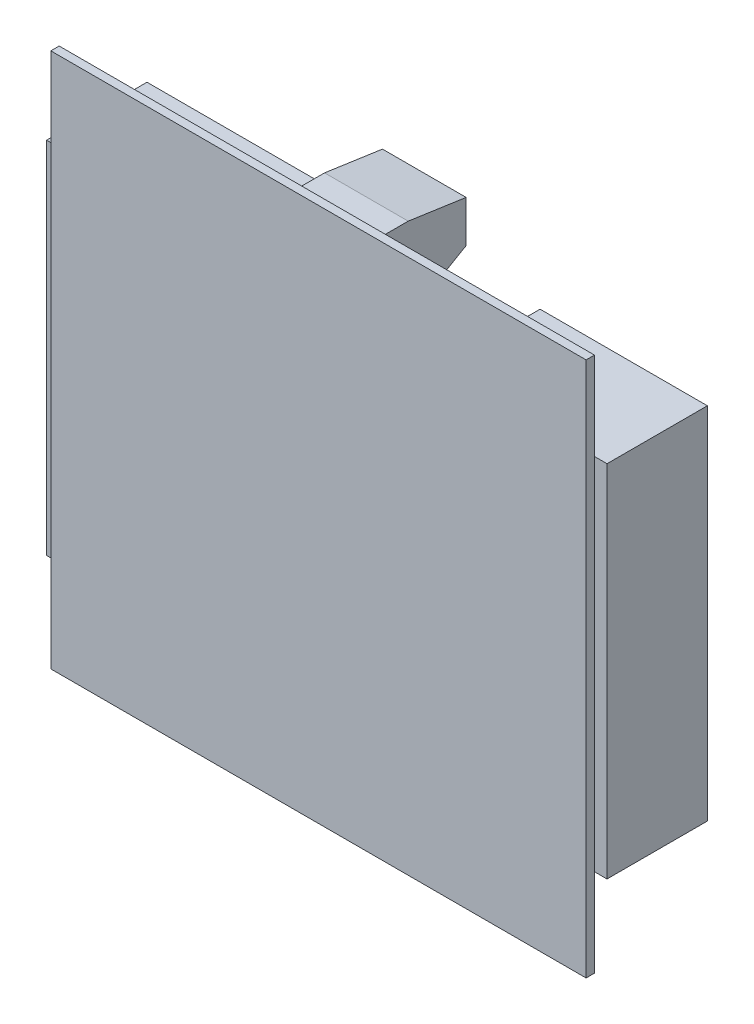
ISO-10303-21;
HEADER;
FILE_DESCRIPTION(('STEP AP214'),'2;1');
FILE_NAME('part.step','',(''),(''),'','','');
FILE_SCHEMA(('AUTOMOTIVE_DESIGN { 1 0 10303 214 1 1 1 1 }'));
ENDSEC;
DATA;
#1=APPLICATION_CONTEXT('core data for automotive mechanical design processes');
#2=APPLICATION_PROTOCOL_DEFINITION('international standard','automotive_design',2000,#1);
#3=PRODUCT_CONTEXT('',#1,'mechanical');
#4=PRODUCT('Part','Part','',(#3));
#5=PRODUCT_RELATED_PRODUCT_CATEGORY('part','',(#4));
#6=PRODUCT_DEFINITION_FORMATION('','',#4);
#7=PRODUCT_DEFINITION_CONTEXT('part definition',#1,'design');
#8=PRODUCT_DEFINITION('design','',#6,#7);
#9=PRODUCT_DEFINITION_SHAPE('','',#8);
#10=(LENGTH_UNIT() NAMED_UNIT(*) SI_UNIT(.MILLI.,.METRE.));
#11=(NAMED_UNIT(*) PLANE_ANGLE_UNIT() SI_UNIT($,.RADIAN.));
#12=(NAMED_UNIT(*) SI_UNIT($,.STERADIAN.) SOLID_ANGLE_UNIT());
#13=UNCERTAINTY_MEASURE_WITH_UNIT(LENGTH_MEASURE(1.E-05),#10,'distance_accuracy_value','');
#14=(GEOMETRIC_REPRESENTATION_CONTEXT(3) GLOBAL_UNCERTAINTY_ASSIGNED_CONTEXT((#13)) GLOBAL_UNIT_ASSIGNED_CONTEXT((#10,
#11,#12)) REPRESENTATION_CONTEXT('',''));
#15=CARTESIAN_POINT('',(0.,0.,0.));
#16=DIRECTION('',(0.,0.,1.));
#17=DIRECTION('',(1.,0.,0.));
#18=AXIS2_PLACEMENT_3D('',#15,#16,#17);
#19=CARTESIAN_POINT('',(0.,0.,0.));
#20=DIRECTION('',(0.,0.,-1.));
#21=DIRECTION('',(-1.,0.,0.));
#22=AXIS2_PLACEMENT_3D('',#19,#20,#21);
#23=PLANE('',#22);
#24=DIRECTION('',(0.,-1.,0.));
#25=VECTOR('',#24,1.);
#26=CARTESIAN_POINT('',(37.,62.,0.));
#27=LINE('',#26,#25);
#28=CARTESIAN_POINT('',(37.,62.,0.));
#29=VERTEX_POINT('',#28);
#30=CARTESIAN_POINT('',(37.,52.,0.));
#31=VERTEX_POINT('',#30);
#32=EDGE_CURVE('E218',#29,#31,#27,.T.);
#33=ORIENTED_EDGE('',*,*,#32,.F.);
#34=DIRECTION('',(-1.,0.,0.));
#35=VECTOR('',#34,1.);
#36=CARTESIAN_POINT('',(37.,62.,0.));
#37=LINE('',#36,#35);
#38=CARTESIAN_POINT('',(27.,62.,0.));
#39=VERTEX_POINT('',#38);
#40=EDGE_CURVE('E230',#29,#39,#37,.T.);
#41=ORIENTED_EDGE('',*,*,#40,.T.);
#42=DIRECTION('',(0.,-1.,0.));
#43=VECTOR('',#42,1.);
#44=CARTESIAN_POINT('',(27.,62.,0.));
#45=LINE('',#44,#43);
#46=CARTESIAN_POINT('',(27.,52.,0.));
#47=VERTEX_POINT('',#46);
#48=EDGE_CURVE('E259',#39,#47,#45,.T.);
#49=ORIENTED_EDGE('',*,*,#48,.T.);
#50=DIRECTION('',(-1.,0.,0.));
#51=VECTOR('',#50,1.);
#52=CARTESIAN_POINT('',(37.,52.,0.));
#53=LINE('',#52,#51);
#54=EDGE_CURVE('E238',#31,#47,#53,.T.);
#55=ORIENTED_EDGE('',*,*,#54,.F.);
#56=EDGE_LOOP('',(#33,#41,#49,#55));
#57=FACE_BOUND('',#56,.T.);
#58=DIRECTION('',(1.,0.,0.));
#59=VECTOR('',#58,1.);
#60=CARTESIAN_POINT('',(65.5,10.5,0.));
#61=LINE('',#60,#59);
#62=CARTESIAN_POINT('',(45.5,10.5,0.));
#63=VERTEX_POINT('',#62);
#64=CARTESIAN_POINT('',(64.,10.5,0.));
#65=VERTEX_POINT('',#64);
#66=EDGE_CURVE('E353',#63,#65,#61,.T.);
#67=ORIENTED_EDGE('',*,*,#66,.T.);
#68=DIRECTION('',(0.,1.,0.));
#69=VECTOR('',#68,1.);
#70=CARTESIAN_POINT('',(64.,0.,0.));
#71=LINE('',#70,#69);
#72=CARTESIAN_POINT('',(64.,0.,0.));
#73=VERTEX_POINT('',#72);
#74=EDGE_CURVE('E462',#73,#65,#71,.T.);
#75=ORIENTED_EDGE('',*,*,#74,.F.);
#76=DIRECTION('',(1.,0.,0.));
#77=VECTOR('',#76,1.);
#78=CARTESIAN_POINT('',(0.,0.,0.));
#79=LINE('',#78,#77);
#80=CARTESIAN_POINT('',(0.,0.,0.));
#81=VERTEX_POINT('',#80);
#82=EDGE_CURVE('E457',#81,#73,#79,.T.);
#83=ORIENTED_EDGE('',*,*,#82,.F.);
#84=DIRECTION('',(0.,-1.,0.));
#85=VECTOR('',#84,1.);
#86=CARTESIAN_POINT('',(0.,0.,0.));
#87=LINE('',#86,#85);
#88=CARTESIAN_POINT('',(0.,10.5,0.));
#89=VERTEX_POINT('',#88);
#90=EDGE_CURVE('E429',#89,#81,#87,.T.);
#91=ORIENTED_EDGE('',*,*,#90,.F.);
#92=DIRECTION('',(1.,0.,0.));
#93=VECTOR('',#92,1.);
#94=CARTESIAN_POINT('',(-1.49999999999999,10.5,0.));
#95=LINE('',#94,#93);
#96=CARTESIAN_POINT('',(18.5,10.5,0.));
#97=VERTEX_POINT('',#96);
#98=EDGE_CURVE('E11',#89,#97,#95,.T.);
#99=ORIENTED_EDGE('',*,*,#98,.T.);
#100=DIRECTION('',(0.,1.,0.));
#101=VECTOR('',#100,1.);
#102=CARTESIAN_POINT('',(18.5,53.5,0.));
#103=LINE('',#102,#101);
#104=CARTESIAN_POINT('',(18.5,53.5,0.));
#105=VERTEX_POINT('',#104);
#106=EDGE_CURVE('E417',#97,#105,#103,.T.);
#107=ORIENTED_EDGE('',*,*,#106,.T.);
#108=DIRECTION('',(-1.,0.,0.));
#109=VECTOR('',#108,1.);
#110=CARTESIAN_POINT('',(-1.5,53.5,0.));
#111=LINE('',#110,#109);
#112=CARTESIAN_POINT('',(0.,53.5,0.));
#113=VERTEX_POINT('',#112);
#114=EDGE_CURVE('E399',#105,#113,#111,.T.);
#115=ORIENTED_EDGE('',*,*,#114,.T.);
#116=CARTESIAN_POINT('',(0.,64.,0.));
#117=VERTEX_POINT('',#116);
#118=EDGE_CURVE('E453',#117,#113,#87,.T.);
#119=ORIENTED_EDGE('',*,*,#118,.F.);
#120=DIRECTION('',(-1.,0.,0.));
#121=VECTOR('',#120,1.);
#122=CARTESIAN_POINT('',(0.,64.,0.));
#123=LINE('',#122,#121);
#124=CARTESIAN_POINT('',(64.,64.,0.));
#125=VERTEX_POINT('',#124);
#126=EDGE_CURVE('E443',#125,#117,#123,.T.);
#127=ORIENTED_EDGE('',*,*,#126,.F.);
#128=CARTESIAN_POINT('',(64.,53.5,0.));
#129=VERTEX_POINT('',#128);
#130=EDGE_CURVE('E461',#129,#125,#71,.T.);
#131=ORIENTED_EDGE('',*,*,#130,.F.);
#132=DIRECTION('',(-1.,0.,0.));
#133=VECTOR('',#132,1.);
#134=CARTESIAN_POINT('',(65.5,53.5,0.));
#135=LINE('',#134,#133);
#136=CARTESIAN_POINT('',(45.5,53.5,0.));
#137=VERTEX_POINT('',#136);
#138=EDGE_CURVE('E369',#129,#137,#135,.T.);
#139=ORIENTED_EDGE('',*,*,#138,.T.);
#140=DIRECTION('',(0.,-1.,0.));
#141=VECTOR('',#140,1.);
#142=CARTESIAN_POINT('',(45.5,53.5,0.));
#143=LINE('',#142,#141);
#144=EDGE_CURVE('E373',#137,#63,#143,.T.);
#145=ORIENTED_EDGE('',*,*,#144,.T.);
#146=EDGE_LOOP('',(#67,#75,#83,#91,#99,#107,#115,#119,#127,#131,#139,#145));
#147=FACE_BOUND('',#146,.T.);
#148=DIRECTION('',(-1.,0.,0.));
#149=VECTOR('',#148,1.);
#150=CARTESIAN_POINT('',(37.,2.,0.));
#151=LINE('',#150,#149);
#152=CARTESIAN_POINT('',(37.,2.,0.));
#153=VERTEX_POINT('',#152);
#154=CARTESIAN_POINT('',(27.,2.,0.));
#155=VERTEX_POINT('',#154);
#156=EDGE_CURVE('E65',#153,#155,#151,.T.);
#157=ORIENTED_EDGE('',*,*,#156,.F.);
#158=DIRECTION('',(0.,-1.,0.));
#159=VECTOR('',#158,1.);
#160=CARTESIAN_POINT('',(37.,2.,0.));
#161=LINE('',#160,#159);
#162=CARTESIAN_POINT('',(37.,12.,0.));
#163=VERTEX_POINT('',#162);
#164=EDGE_CURVE('E288',#163,#153,#161,.T.);
#165=ORIENTED_EDGE('',*,*,#164,.F.);
#166=DIRECTION('',(-1.,0.,0.));
#167=VECTOR('',#166,1.);
#168=CARTESIAN_POINT('',(37.,12.,0.));
#169=LINE('',#168,#167);
#170=CARTESIAN_POINT('',(27.,12.,0.));
#171=VERTEX_POINT('',#170);
#172=EDGE_CURVE('E309',#163,#171,#169,.T.);
#173=ORIENTED_EDGE('',*,*,#172,.T.);
#174=DIRECTION('',(0.,-1.,0.));
#175=VECTOR('',#174,1.);
#176=CARTESIAN_POINT('',(27.,2.,0.));
#177=LINE('',#176,#175);
#178=EDGE_CURVE('E237',#171,#155,#177,.T.);
#179=ORIENTED_EDGE('',*,*,#178,.T.);
#180=EDGE_LOOP('',(#157,#165,#173,#179));
#181=FACE_BOUND('',#180,.T.);
#182=ADVANCED_FACE('F39',(#57,#147,#181),#23,.T.);
#183=CARTESIAN_POINT('',(0.,0.,1.));
#184=DIRECTION('',(1.,0.,0.));
#185=DIRECTION('',(0.,0.,-1.));
#186=AXIS2_PLACEMENT_3D('',#183,#184,#185);
#187=PLANE('',#186);
#188=ORIENTED_EDGE('',*,*,#118,.T.);
#189=EDGE_CURVE('E458',#113,#89,#87,.T.);
#190=ORIENTED_EDGE('',*,*,#189,.T.);
#191=ORIENTED_EDGE('',*,*,#90,.T.);
#192=DIRECTION('',(0.,0.,-1.));
#193=VECTOR('',#192,1.);
#194=CARTESIAN_POINT('',(0.,0.,1.));
#195=LINE('',#194,#193);
#196=CARTESIAN_POINT('',(0.,0.,1.));
#197=VERTEX_POINT('',#196);
#198=EDGE_CURVE('E43',#197,#81,#195,.T.);
#199=ORIENTED_EDGE('',*,*,#198,.F.);
#200=DIRECTION('',(0.,-1.,0.));
#201=VECTOR('',#200,1.);
#202=CARTESIAN_POINT('',(0.,0.,1.));
#203=LINE('',#202,#201);
#204=CARTESIAN_POINT('',(0.,64.,1.));
#205=VERTEX_POINT('',#204);
#206=EDGE_CURVE('E438',#205,#197,#203,.T.);
#207=ORIENTED_EDGE('',*,*,#206,.F.);
#208=DIRECTION('',(0.,0.,-1.));
#209=VECTOR('',#208,1.);
#210=CARTESIAN_POINT('',(0.,64.,1.));
#211=LINE('',#210,#209);
#212=EDGE_CURVE('E452',#205,#117,#211,.T.);
#213=ORIENTED_EDGE('',*,*,#212,.T.);
#214=EDGE_LOOP('',(#188,#190,#191,#199,#207,#213));
#215=FACE_BOUND('',#214,.T.);
#216=ADVANCED_FACE('F41',(#215),#187,.F.);
#217=CARTESIAN_POINT('',(0.,0.,1.));
#218=DIRECTION('',(0.,1.,0.));
#219=DIRECTION('',(0.,0.,1.));
#220=AXIS2_PLACEMENT_3D('',#217,#218,#219);
#221=PLANE('',#220);
#222=ORIENTED_EDGE('',*,*,#82,.T.);
#223=DIRECTION('',(0.,0.,-1.));
#224=VECTOR('',#223,1.);
#225=CARTESIAN_POINT('',(64.,0.,1.));
#226=LINE('',#225,#224);
#227=CARTESIAN_POINT('',(64.,0.,1.));
#228=VERTEX_POINT('',#227);
#229=EDGE_CURVE('E475',#228,#73,#226,.T.);
#230=ORIENTED_EDGE('',*,*,#229,.F.);
#231=DIRECTION('',(1.,0.,0.));
#232=VECTOR('',#231,1.);
#233=CARTESIAN_POINT('',(0.,0.,1.));
#234=LINE('',#233,#232);
#235=EDGE_CURVE('E442',#197,#228,#234,.T.);
#236=ORIENTED_EDGE('',*,*,#235,.F.);
#237=ORIENTED_EDGE('',*,*,#198,.T.);
#238=EDGE_LOOP('',(#222,#230,#236,#237));
#239=FACE_BOUND('',#238,.T.);
#240=ADVANCED_FACE('F486',(#239),#221,.F.);
#241=CARTESIAN_POINT('',(64.,0.,1.));
#242=DIRECTION('',(-1.,0.,0.));
#243=DIRECTION('',(0.,0.,1.));
#244=AXIS2_PLACEMENT_3D('',#241,#242,#243);
#245=PLANE('',#244);
#246=ORIENTED_EDGE('',*,*,#74,.T.);
#247=EDGE_CURVE('E466',#65,#129,#71,.T.);
#248=ORIENTED_EDGE('',*,*,#247,.T.);
#249=ORIENTED_EDGE('',*,*,#130,.T.);
#250=DIRECTION('',(0.,0.,-1.));
#251=VECTOR('',#250,1.);
#252=CARTESIAN_POINT('',(64.,64.,1.));
#253=LINE('',#252,#251);
#254=CARTESIAN_POINT('',(64.,64.,1.));
#255=VERTEX_POINT('',#254);
#256=EDGE_CURVE('E472',#255,#125,#253,.T.);
#257=ORIENTED_EDGE('',*,*,#256,.F.);
#258=DIRECTION('',(0.,1.,0.));
#259=VECTOR('',#258,1.);
#260=CARTESIAN_POINT('',(64.,0.,1.));
#261=LINE('',#260,#259);
#262=EDGE_CURVE('E446',#228,#255,#261,.T.);
#263=ORIENTED_EDGE('',*,*,#262,.F.);
#264=ORIENTED_EDGE('',*,*,#229,.T.);
#265=EDGE_LOOP('',(#246,#248,#249,#257,#263,#264));
#266=FACE_BOUND('',#265,.T.);
#267=ADVANCED_FACE('F496',(#266),#245,.F.);
#268=CARTESIAN_POINT('',(0.,64.,1.));
#269=DIRECTION('',(0.,-1.,0.));
#270=DIRECTION('',(0.,0.,-1.));
#271=AXIS2_PLACEMENT_3D('',#268,#269,#270);
#272=PLANE('',#271);
#273=ORIENTED_EDGE('',*,*,#126,.T.);
#274=ORIENTED_EDGE('',*,*,#212,.F.);
#275=DIRECTION('',(-1.,0.,0.));
#276=VECTOR('',#275,1.);
#277=CARTESIAN_POINT('',(0.,64.,1.));
#278=LINE('',#277,#276);
#279=EDGE_CURVE('E449',#255,#205,#278,.T.);
#280=ORIENTED_EDGE('',*,*,#279,.F.);
#281=ORIENTED_EDGE('',*,*,#256,.T.);
#282=EDGE_LOOP('',(#273,#274,#280,#281));
#283=FACE_BOUND('',#282,.T.);
#284=ADVANCED_FACE('F549',(#283),#272,.F.);
#285=CARTESIAN_POINT('',(0.,0.,1.));
#286=DIRECTION('',(0.,0.,-1.));
#287=DIRECTION('',(-1.,0.,0.));
#288=AXIS2_PLACEMENT_3D('',#285,#286,#287);
#289=PLANE('',#288);
#290=ORIENTED_EDGE('',*,*,#206,.T.);
#291=ORIENTED_EDGE('',*,*,#235,.T.);
#292=ORIENTED_EDGE('',*,*,#262,.T.);
#293=ORIENTED_EDGE('',*,*,#279,.T.);
#294=EDGE_LOOP('',(#290,#291,#292,#293));
#295=FACE_BOUND('',#294,.T.);
#296=ADVANCED_FACE('F547',(#295),#289,.F.);
#297=CARTESIAN_POINT('',(0.,0.,0.));
#298=DIRECTION('',(0.,0.,1.));
#299=DIRECTION('',(1.,0.,0.));
#300=AXIS2_PLACEMENT_3D('',#297,#298,#299);
#301=PLANE('',#300);
#302=ORIENTED_EDGE('',*,*,#189,.F.);
#303=CARTESIAN_POINT('',(-1.5,53.5,0.));
#304=VERTEX_POINT('',#303);
#305=EDGE_CURVE('E421',#113,#304,#111,.T.);
#306=ORIENTED_EDGE('',*,*,#305,.T.);
#307=DIRECTION('',(0.,-1.,0.));
#308=VECTOR('',#307,1.);
#309=CARTESIAN_POINT('',(-1.5,53.5,0.));
#310=LINE('',#309,#308);
#311=CARTESIAN_POINT('',(-1.49999999999999,10.5,0.));
#312=VERTEX_POINT('',#311);
#313=EDGE_CURVE('E385',#304,#312,#310,.T.);
#314=ORIENTED_EDGE('',*,*,#313,.T.);
#315=EDGE_CURVE('E50',#312,#89,#95,.T.);
#316=ORIENTED_EDGE('',*,*,#315,.T.);
#317=EDGE_LOOP('',(#302,#306,#314,#316));
#318=FACE_BOUND('',#317,.T.);
#319=ADVANCED_FACE('F574',(#318),#301,.T.);
#320=CARTESIAN_POINT('',(-1.5,53.5,-12.));
#321=DIRECTION('',(-1.,0.,0.));
#322=DIRECTION('',(0.,-1.,0.));
#323=AXIS2_PLACEMENT_3D('',#320,#321,#322);
#324=PLANE('',#323);
#325=ORIENTED_EDGE('',*,*,#313,.F.);
#326=DIRECTION('',(0.,0.,1.));
#327=VECTOR('',#326,1.);
#328=CARTESIAN_POINT('',(-1.5,53.5,-12.));
#329=LINE('',#328,#327);
#330=CARTESIAN_POINT('',(-1.5,53.5,-12.));
#331=VERTEX_POINT('',#330);
#332=EDGE_CURVE('E425',#331,#304,#329,.T.);
#333=ORIENTED_EDGE('',*,*,#332,.F.);
#334=DIRECTION('',(0.,-1.,0.));
#335=VECTOR('',#334,1.);
#336=CARTESIAN_POINT('',(-1.5,53.5,-12.));
#337=LINE('',#336,#335);
#338=CARTESIAN_POINT('',(-1.49999999999999,10.5,-12.));
#339=VERTEX_POINT('',#338);
#340=EDGE_CURVE('E394',#331,#339,#337,.T.);
#341=ORIENTED_EDGE('',*,*,#340,.T.);
#342=DIRECTION('',(0.,0.,1.));
#343=VECTOR('',#342,1.);
#344=CARTESIAN_POINT('',(-1.49999999999999,10.5,-12.));
#345=LINE('',#344,#343);
#346=EDGE_CURVE('E411',#339,#312,#345,.T.);
#347=ORIENTED_EDGE('',*,*,#346,.T.);
#348=EDGE_LOOP('',(#325,#333,#341,#347));
#349=FACE_BOUND('',#348,.T.);
#350=ADVANCED_FACE('F580',(#349),#324,.T.);
#351=CARTESIAN_POINT('',(-1.5,53.5,-12.));
#352=DIRECTION('',(0.,1.,0.));
#353=DIRECTION('',(0.,0.,1.));
#354=AXIS2_PLACEMENT_3D('',#351,#352,#353);
#355=PLANE('',#354);
#356=ORIENTED_EDGE('',*,*,#114,.F.);
#357=DIRECTION('',(0.,0.,1.));
#358=VECTOR('',#357,1.);
#359=CARTESIAN_POINT('',(18.5,53.5,-12.));
#360=LINE('',#359,#358);
#361=CARTESIAN_POINT('',(18.5,53.5,-12.));
#362=VERTEX_POINT('',#361);
#363=EDGE_CURVE('E430',#362,#105,#360,.T.);
#364=ORIENTED_EDGE('',*,*,#363,.F.);
#365=DIRECTION('',(-1.,0.,0.));
#366=VECTOR('',#365,1.);
#367=CARTESIAN_POINT('',(-1.5,53.5,-12.));
#368=LINE('',#367,#366);
#369=EDGE_CURVE('E407',#362,#331,#368,.T.);
#370=ORIENTED_EDGE('',*,*,#369,.T.);
#371=ORIENTED_EDGE('',*,*,#332,.T.);
#372=ORIENTED_EDGE('',*,*,#305,.F.);
#373=EDGE_LOOP('',(#356,#364,#370,#371,#372));
#374=FACE_BOUND('',#373,.T.);
#375=ADVANCED_FACE('F588',(#374),#355,.T.);
#376=CARTESIAN_POINT('',(18.5,53.5,-12.));
#377=DIRECTION('',(1.,0.,0.));
#378=DIRECTION('',(0.,1.,0.));
#379=AXIS2_PLACEMENT_3D('',#376,#377,#378);
#380=PLANE('',#379);
#381=ORIENTED_EDGE('',*,*,#106,.F.);
#382=DIRECTION('',(0.,0.,1.));
#383=VECTOR('',#382,1.);
#384=CARTESIAN_POINT('',(18.5,10.5,-12.));
#385=LINE('',#384,#383);
#386=CARTESIAN_POINT('',(18.5,10.5,-12.));
#387=VERTEX_POINT('',#386);
#388=EDGE_CURVE('E433',#387,#97,#385,.T.);
#389=ORIENTED_EDGE('',*,*,#388,.F.);
#390=DIRECTION('',(0.,1.,0.));
#391=VECTOR('',#390,1.);
#392=CARTESIAN_POINT('',(18.5,53.5,-12.));
#393=LINE('',#392,#391);
#394=EDGE_CURVE('E403',#387,#362,#393,.T.);
#395=ORIENTED_EDGE('',*,*,#394,.T.);
#396=ORIENTED_EDGE('',*,*,#363,.T.);
#397=EDGE_LOOP('',(#381,#389,#395,#396));
#398=FACE_BOUND('',#397,.T.);
#399=ADVANCED_FACE('F595',(#398),#380,.T.);
#400=CARTESIAN_POINT('',(-1.49999999999999,10.5,-12.));
#401=DIRECTION('',(0.,-1.,0.));
#402=DIRECTION('',(1.,0.,0.));
#403=AXIS2_PLACEMENT_3D('',#400,#401,#402);
#404=PLANE('',#403);
#405=ORIENTED_EDGE('',*,*,#315,.F.);
#406=ORIENTED_EDGE('',*,*,#346,.F.);
#407=DIRECTION('',(1.,0.,0.));
#408=VECTOR('',#407,1.);
#409=CARTESIAN_POINT('',(-1.49999999999999,10.5,-12.));
#410=LINE('',#409,#408);
#411=EDGE_CURVE('E398',#339,#387,#410,.T.);
#412=ORIENTED_EDGE('',*,*,#411,.T.);
#413=ORIENTED_EDGE('',*,*,#388,.T.);
#414=ORIENTED_EDGE('',*,*,#98,.F.);
#415=EDGE_LOOP('',(#405,#406,#412,#413,#414));
#416=FACE_BOUND('',#415,.T.);
#417=ADVANCED_FACE('F603',(#416),#404,.T.);
#418=CARTESIAN_POINT('',(0.,0.,-12.));
#419=DIRECTION('',(0.,0.,1.));
#420=DIRECTION('',(1.,0.,0.));
#421=AXIS2_PLACEMENT_3D('',#418,#419,#420);
#422=PLANE('',#421);
#423=ORIENTED_EDGE('',*,*,#340,.F.);
#424=ORIENTED_EDGE('',*,*,#369,.F.);
#425=ORIENTED_EDGE('',*,*,#394,.F.);
#426=ORIENTED_EDGE('',*,*,#411,.F.);
#427=EDGE_LOOP('',(#423,#424,#425,#426));
#428=FACE_BOUND('',#427,.T.);
#429=ADVANCED_FACE('F611',(#428),#422,.F.);
#430=CARTESIAN_POINT('',(0.,0.,0.));
#431=DIRECTION('',(0.,0.,-1.));
#432=DIRECTION('',(-1.,0.,0.));
#433=AXIS2_PLACEMENT_3D('',#430,#431,#432);
#434=PLANE('',#433);
#435=CARTESIAN_POINT('',(65.5,53.5,0.));
#436=VERTEX_POINT('',#435);
#437=EDGE_CURVE('E370',#436,#129,#135,.T.);
#438=ORIENTED_EDGE('',*,*,#437,.T.);
#439=ORIENTED_EDGE('',*,*,#247,.F.);
#440=CARTESIAN_POINT('',(65.5,10.5,0.));
#441=VERTEX_POINT('',#440);
#442=EDGE_CURVE('E377',#65,#441,#61,.T.);
#443=ORIENTED_EDGE('',*,*,#442,.T.);
#444=DIRECTION('',(0.,1.,0.));
#445=VECTOR('',#444,1.);
#446=CARTESIAN_POINT('',(65.5,53.5,0.));
#447=LINE('',#446,#445);
#448=EDGE_CURVE('E347',#441,#436,#447,.T.);
#449=ORIENTED_EDGE('',*,*,#448,.T.);
#450=EDGE_LOOP('',(#438,#439,#443,#449));
#451=FACE_BOUND('',#450,.T.);
#452=ADVANCED_FACE('F522',(#451),#434,.F.);
#453=CARTESIAN_POINT('',(65.5,53.5,-12.));
#454=DIRECTION('',(1.,0.,0.));
#455=DIRECTION('',(0.,1.,0.));
#456=AXIS2_PLACEMENT_3D('',#453,#454,#455);
#457=PLANE('',#456);
#458=ORIENTED_EDGE('',*,*,#448,.F.);
#459=DIRECTION('',(0.,0.,1.));
#460=VECTOR('',#459,1.);
#461=CARTESIAN_POINT('',(65.5,10.5,-12.));
#462=LINE('',#461,#460);
#463=CARTESIAN_POINT('',(65.5,10.5,-12.));
#464=VERTEX_POINT('',#463);
#465=EDGE_CURVE('E381',#464,#441,#462,.T.);
#466=ORIENTED_EDGE('',*,*,#465,.F.);
#467=DIRECTION('',(0.,1.,0.));
#468=VECTOR('',#467,1.);
#469=CARTESIAN_POINT('',(65.5,53.5,-12.));
#470=LINE('',#469,#468);
#471=CARTESIAN_POINT('',(65.5,53.5,-12.));
#472=VERTEX_POINT('',#471);
#473=EDGE_CURVE('E348',#464,#472,#470,.T.);
#474=ORIENTED_EDGE('',*,*,#473,.T.);
#475=DIRECTION('',(0.,0.,1.));
#476=VECTOR('',#475,1.);
#477=CARTESIAN_POINT('',(65.5,53.5,-12.));
#478=LINE('',#477,#476);
#479=EDGE_CURVE('E365',#472,#436,#478,.T.);
#480=ORIENTED_EDGE('',*,*,#479,.T.);
#481=EDGE_LOOP('',(#458,#466,#474,#480));
#482=FACE_BOUND('',#481,.T.);
#483=ADVANCED_FACE('F524',(#482),#457,.T.);
#484=CARTESIAN_POINT('',(65.5,10.5,-12.));
#485=DIRECTION('',(0.,-1.,0.));
#486=DIRECTION('',(1.,0.,0.));
#487=AXIS2_PLACEMENT_3D('',#484,#485,#486);
#488=PLANE('',#487);
#489=ORIENTED_EDGE('',*,*,#66,.F.);
#490=DIRECTION('',(0.,0.,1.));
#491=VECTOR('',#490,1.);
#492=CARTESIAN_POINT('',(45.5,10.5,-12.));
#493=LINE('',#492,#491);
#494=CARTESIAN_POINT('',(45.5,10.5,-12.));
#495=VERTEX_POINT('',#494);
#496=EDGE_CURVE('E386',#495,#63,#493,.T.);
#497=ORIENTED_EDGE('',*,*,#496,.F.);
#498=DIRECTION('',(1.,0.,0.));
#499=VECTOR('',#498,1.);
#500=CARTESIAN_POINT('',(65.5,10.5,-12.));
#501=LINE('',#500,#499);
#502=EDGE_CURVE('E361',#495,#464,#501,.T.);
#503=ORIENTED_EDGE('',*,*,#502,.T.);
#504=ORIENTED_EDGE('',*,*,#465,.T.);
#505=ORIENTED_EDGE('',*,*,#442,.F.);
#506=EDGE_LOOP('',(#489,#497,#503,#504,#505));
#507=FACE_BOUND('',#506,.T.);
#508=ADVANCED_FACE('F520',(#507),#488,.T.);
#509=CARTESIAN_POINT('',(45.5,53.5,-12.));
#510=DIRECTION('',(-1.,0.,0.));
#511=DIRECTION('',(0.,0.,1.));
#512=AXIS2_PLACEMENT_3D('',#509,#510,#511);
#513=PLANE('',#512);
#514=ORIENTED_EDGE('',*,*,#144,.F.);
#515=DIRECTION('',(0.,0.,1.));
#516=VECTOR('',#515,1.);
#517=CARTESIAN_POINT('',(45.5,53.5,-12.));
#518=LINE('',#517,#516);
#519=CARTESIAN_POINT('',(45.5,53.5,-12.));
#520=VERTEX_POINT('',#519);
#521=EDGE_CURVE('E389',#520,#137,#518,.T.);
#522=ORIENTED_EDGE('',*,*,#521,.F.);
#523=DIRECTION('',(0.,-1.,0.));
#524=VECTOR('',#523,1.);
#525=CARTESIAN_POINT('',(45.5,53.5,-12.));
#526=LINE('',#525,#524);
#527=EDGE_CURVE('E357',#520,#495,#526,.T.);
#528=ORIENTED_EDGE('',*,*,#527,.T.);
#529=ORIENTED_EDGE('',*,*,#496,.T.);
#530=EDGE_LOOP('',(#514,#522,#528,#529));
#531=FACE_BOUND('',#530,.T.);
#532=ADVANCED_FACE('F517',(#531),#513,.T.);
#533=CARTESIAN_POINT('',(65.5,53.5,-12.));
#534=DIRECTION('',(0.,1.,0.));
#535=DIRECTION('',(0.,0.,1.));
#536=AXIS2_PLACEMENT_3D('',#533,#534,#535);
#537=PLANE('',#536);
#538=ORIENTED_EDGE('',*,*,#437,.F.);
#539=ORIENTED_EDGE('',*,*,#479,.F.);
#540=DIRECTION('',(-1.,0.,0.));
#541=VECTOR('',#540,1.);
#542=CARTESIAN_POINT('',(65.5,53.5,-12.));
#543=LINE('',#542,#541);
#544=EDGE_CURVE('E352',#472,#520,#543,.T.);
#545=ORIENTED_EDGE('',*,*,#544,.T.);
#546=ORIENTED_EDGE('',*,*,#521,.T.);
#547=ORIENTED_EDGE('',*,*,#138,.F.);
#548=EDGE_LOOP('',(#538,#539,#545,#546,#547));
#549=FACE_BOUND('',#548,.T.);
#550=ADVANCED_FACE('F513',(#549),#537,.T.);
#551=CARTESIAN_POINT('',(0.,0.,-12.));
#552=DIRECTION('',(0.,0.,-1.));
#553=DIRECTION('',(-1.,0.,0.));
#554=AXIS2_PLACEMENT_3D('',#551,#552,#553);
#555=PLANE('',#554);
#556=ORIENTED_EDGE('',*,*,#473,.F.);
#557=ORIENTED_EDGE('',*,*,#502,.F.);
#558=ORIENTED_EDGE('',*,*,#527,.F.);
#559=ORIENTED_EDGE('',*,*,#544,.F.);
#560=EDGE_LOOP('',(#556,#557,#558,#559));
#561=FACE_BOUND('',#560,.T.);
#562=ADVANCED_FACE('F527',(#561),#555,.T.);
#563=CARTESIAN_POINT('',(37.,2.,-4.7300281436331));
#564=DIRECTION('',(0.,1.,0.));
#565=DIRECTION('',(0.,0.,1.));
#566=AXIS2_PLACEMENT_3D('',#563,#564,#565);
#567=PLANE('',#566);
#568=DIRECTION('',(0.,0.,-1.));
#569=VECTOR('',#568,1.);
#570=CARTESIAN_POINT('',(27.,2.,-4.7300281436331));
#571=LINE('',#570,#569);
#572=CARTESIAN_POINT('',(27.,2.,-4.7300281436331));
#573=VERTEX_POINT('',#572);
#574=EDGE_CURVE('E312',#155,#573,#571,.T.);
#575=ORIENTED_EDGE('',*,*,#574,.T.);
#576=DIRECTION('',(-1.,0.,0.));
#577=VECTOR('',#576,1.);
#578=CARTESIAN_POINT('',(37.,2.,-4.7300281436331));
#579=LINE('',#578,#577);
#580=CARTESIAN_POINT('',(37.,2.,-4.7300281436331));
#581=VERTEX_POINT('',#580);
#582=EDGE_CURVE('E341',#581,#573,#579,.T.);
#583=ORIENTED_EDGE('',*,*,#582,.F.);
#584=DIRECTION('',(0.,0.,-1.));
#585=VECTOR('',#584,1.);
#586=CARTESIAN_POINT('',(37.,2.,-4.7300281436331));
#587=LINE('',#586,#585);
#588=EDGE_CURVE('E292',#153,#581,#587,.T.);
#589=ORIENTED_EDGE('',*,*,#588,.F.);
#590=ORIENTED_EDGE('',*,*,#156,.T.);
#591=EDGE_LOOP('',(#575,#583,#589,#590));
#592=FACE_BOUND('',#591,.T.);
#593=ADVANCED_FACE('F529',(#592),#567,.F.);
#594=CARTESIAN_POINT('',(37.,3.00213412204359,-11.6545349660995));
#595=DIRECTION('',(0.,0.98968933881956,0.143230627405256));
#596=DIRECTION('',(0.,-0.143230627405256,0.98968933881956));
#597=AXIS2_PLACEMENT_3D('',#594,#595,#596);
#598=PLANE('',#597);
#599=DIRECTION('',(0.,0.143230627405256,-0.98968933881956));
#600=VECTOR('',#599,1.);
#601=CARTESIAN_POINT('',(27.,3.00213412204359,-11.6545349660995));
#602=LINE('',#601,#600);
#603=CARTESIAN_POINT('',(27.,3.00213412204359,-11.6545349660995));
#604=VERTEX_POINT('',#603);
#605=EDGE_CURVE('E315',#573,#604,#602,.T.);
#606=ORIENTED_EDGE('',*,*,#605,.T.);
#607=DIRECTION('',(-1.,0.,0.));
#608=VECTOR('',#607,1.);
#609=CARTESIAN_POINT('',(37.,3.00213412204359,-11.6545349660995));
#610=LINE('',#609,#608);
#611=CARTESIAN_POINT('',(37.,3.00213412204359,-11.6545349660995));
#612=VERTEX_POINT('',#611);
#613=EDGE_CURVE('E337',#612,#604,#610,.T.);
#614=ORIENTED_EDGE('',*,*,#613,.F.);
#615=DIRECTION('',(0.,0.143230627405256,-0.98968933881956));
#616=VECTOR('',#615,1.);
#617=CARTESIAN_POINT('',(37.,3.00213412204359,-11.6545349660995));
#618=LINE('',#617,#616);
#619=EDGE_CURVE('E296',#581,#612,#618,.T.);
#620=ORIENTED_EDGE('',*,*,#619,.F.);
#621=ORIENTED_EDGE('',*,*,#582,.T.);
#622=EDGE_LOOP('',(#606,#614,#620,#621));
#623=FACE_BOUND('',#622,.T.);
#624=ADVANCED_FACE('F535',(#623),#598,.F.);
#625=CARTESIAN_POINT('',(37.,8.00213412204359,-11.6545349660995));
#626=DIRECTION('',(0.,0.,1.));
#627=DIRECTION('',(1.,0.,0.));
#628=AXIS2_PLACEMENT_3D('',#625,#626,#627);
#629=PLANE('',#628);
#630=DIRECTION('',(0.,1.,0.));
#631=VECTOR('',#630,1.);
#632=CARTESIAN_POINT('',(27.,8.00213412204359,-11.6545349660995));
#633=LINE('',#632,#631);
#634=CARTESIAN_POINT('',(27.,8.00213412204359,-11.6545349660995));
#635=VERTEX_POINT('',#634);
#636=EDGE_CURVE('E318',#604,#635,#633,.T.);
#637=ORIENTED_EDGE('',*,*,#636,.T.);
#638=DIRECTION('',(-1.,0.,0.));
#639=VECTOR('',#638,1.);
#640=CARTESIAN_POINT('',(37.,8.00213412204359,-11.6545349660995));
#641=LINE('',#640,#639);
#642=CARTESIAN_POINT('',(37.,8.00213412204359,-11.6545349660995));
#643=VERTEX_POINT('',#642);
#644=EDGE_CURVE('E333',#643,#635,#641,.T.);
#645=ORIENTED_EDGE('',*,*,#644,.F.);
#646=DIRECTION('',(0.,1.,0.));
#647=VECTOR('',#646,1.);
#648=CARTESIAN_POINT('',(37.,8.00213412204359,-11.6545349660995));
#649=LINE('',#648,#647);
#650=EDGE_CURVE('E299',#612,#643,#649,.T.);
#651=ORIENTED_EDGE('',*,*,#650,.F.);
#652=ORIENTED_EDGE('',*,*,#613,.T.);
#653=EDGE_LOOP('',(#637,#645,#651,#652));
#654=FACE_BOUND('',#653,.T.);
#655=ADVANCED_FACE('F670',(#654),#629,.F.);
#656=CARTESIAN_POINT('',(37.,12.,-4.7300281436331));
#657=DIRECTION('',(0.,-0.866025403784438,0.500000000000001));
#658=DIRECTION('',(0.,-0.500000000000001,-0.866025403784438));
#659=AXIS2_PLACEMENT_3D('',#656,#657,#658);
#660=PLANE('',#659);
#661=DIRECTION('',(0.,0.500000000000001,0.866025403784438));
#662=VECTOR('',#661,1.);
#663=CARTESIAN_POINT('',(27.,12.,-4.7300281436331));
#664=LINE('',#663,#662);
#665=CARTESIAN_POINT('',(27.,12.,-4.7300281436331));
#666=VERTEX_POINT('',#665);
#667=EDGE_CURVE('E321',#635,#666,#664,.T.);
#668=ORIENTED_EDGE('',*,*,#667,.T.);
#669=DIRECTION('',(-1.,0.,0.));
#670=VECTOR('',#669,1.);
#671=CARTESIAN_POINT('',(37.,12.,-4.7300281436331));
#672=LINE('',#671,#670);
#673=CARTESIAN_POINT('',(37.,12.,-4.7300281436331));
#674=VERTEX_POINT('',#673);
#675=EDGE_CURVE('E329',#674,#666,#672,.T.);
#676=ORIENTED_EDGE('',*,*,#675,.F.);
#677=DIRECTION('',(0.,0.500000000000001,0.866025403784438));
#678=VECTOR('',#677,1.);
#679=CARTESIAN_POINT('',(37.,12.,-4.7300281436331));
#680=LINE('',#679,#678);
#681=EDGE_CURVE('E302',#643,#674,#680,.T.);
#682=ORIENTED_EDGE('',*,*,#681,.F.);
#683=ORIENTED_EDGE('',*,*,#644,.T.);
#684=EDGE_LOOP('',(#668,#676,#682,#683));
#685=FACE_BOUND('',#684,.T.);
#686=ADVANCED_FACE('F680',(#685),#660,.F.);
#687=CARTESIAN_POINT('',(37.,12.,0.));
#688=DIRECTION('',(0.,-1.,0.));
#689=DIRECTION('',(0.,0.,-1.));
#690=AXIS2_PLACEMENT_3D('',#687,#688,#689);
#691=PLANE('',#690);
#692=DIRECTION('',(0.,0.,1.));
#693=VECTOR('',#692,1.);
#694=CARTESIAN_POINT('',(27.,12.,0.));
#695=LINE('',#694,#693);
#696=EDGE_CURVE('E293',#666,#171,#695,.T.);
#697=ORIENTED_EDGE('',*,*,#696,.T.);
#698=ORIENTED_EDGE('',*,*,#172,.F.);
#699=DIRECTION('',(0.,0.,1.));
#700=VECTOR('',#699,1.);
#701=CARTESIAN_POINT('',(37.,12.,0.));
#702=LINE('',#701,#700);
#703=EDGE_CURVE('E305',#674,#163,#702,.T.);
#704=ORIENTED_EDGE('',*,*,#703,.F.);
#705=ORIENTED_EDGE('',*,*,#675,.T.);
#706=EDGE_LOOP('',(#697,#698,#704,#705));
#707=FACE_BOUND('',#706,.T.);
#708=ADVANCED_FACE('F690',(#707),#691,.F.);
#709=CARTESIAN_POINT('',(37.,0.,0.));
#710=DIRECTION('',(-1.,0.,0.));
#711=DIRECTION('',(0.,0.,1.));
#712=AXIS2_PLACEMENT_3D('',#709,#710,#711);
#713=PLANE('',#712);
#714=ORIENTED_EDGE('',*,*,#164,.T.);
#715=ORIENTED_EDGE('',*,*,#588,.T.);
#716=ORIENTED_EDGE('',*,*,#619,.T.);
#717=ORIENTED_EDGE('',*,*,#650,.T.);
#718=ORIENTED_EDGE('',*,*,#681,.T.);
#719=ORIENTED_EDGE('',*,*,#703,.T.);
#720=EDGE_LOOP('',(#714,#715,#716,#717,#718,#719));
#721=FACE_BOUND('',#720,.T.);
#722=ADVANCED_FACE('F700',(#721),#713,.F.);
#723=CARTESIAN_POINT('',(27.,0.,0.));
#724=DIRECTION('',(-1.,0.,0.));
#725=DIRECTION('',(0.,0.,1.));
#726=AXIS2_PLACEMENT_3D('',#723,#724,#725);
#727=PLANE('',#726);
#728=ORIENTED_EDGE('',*,*,#178,.F.);
#729=ORIENTED_EDGE('',*,*,#696,.F.);
#730=ORIENTED_EDGE('',*,*,#667,.F.);
#731=ORIENTED_EDGE('',*,*,#636,.F.);
#732=ORIENTED_EDGE('',*,*,#605,.F.);
#733=ORIENTED_EDGE('',*,*,#574,.F.);
#734=EDGE_LOOP('',(#728,#729,#730,#731,#732,#733));
#735=FACE_BOUND('',#734,.T.);
#736=ADVANCED_FACE('F710',(#735),#727,.T.);
#737=CARTESIAN_POINT('',(37.,62.,-4.7300281436331));
#738=DIRECTION('',(0.,-1.,0.));
#739=DIRECTION('',(0.,0.,-1.));
#740=AXIS2_PLACEMENT_3D('',#737,#738,#739);
#741=PLANE('',#740);
#742=DIRECTION('',(0.,0.,1.));
#743=VECTOR('',#742,1.);
#744=CARTESIAN_POINT('',(27.,62.,-4.7300281436331));
#745=LINE('',#744,#743);
#746=CARTESIAN_POINT('',(27.,62.,-4.7300281436331));
#747=VERTEX_POINT('',#746);
#748=EDGE_CURVE('E233',#747,#39,#745,.T.);
#749=ORIENTED_EDGE('',*,*,#748,.T.);
#750=ORIENTED_EDGE('',*,*,#40,.F.);
#751=DIRECTION('',(0.,0.,1.));
#752=VECTOR('',#751,1.);
#753=CARTESIAN_POINT('',(37.,62.,-4.7300281436331));
#754=LINE('',#753,#752);
#755=CARTESIAN_POINT('',(37.,62.,-4.7300281436331));
#756=VERTEX_POINT('',#755);
#757=EDGE_CURVE('E214',#756,#29,#754,.T.);
#758=ORIENTED_EDGE('',*,*,#757,.F.);
#759=DIRECTION('',(-1.,0.,0.));
#760=VECTOR('',#759,1.);
#761=CARTESIAN_POINT('',(37.,62.,-4.7300281436331));
#762=LINE('',#761,#760);
#763=EDGE_CURVE('E256',#756,#747,#762,.T.);
#764=ORIENTED_EDGE('',*,*,#763,.T.);
#765=EDGE_LOOP('',(#749,#750,#758,#764));
#766=FACE_BOUND('',#765,.T.);
#767=ADVANCED_FACE('F231',(#766),#741,.F.);
#768=CARTESIAN_POINT('',(37.,52.,0.));
#769=DIRECTION('',(0.,1.,0.));
#770=DIRECTION('',(0.,0.,1.));
#771=AXIS2_PLACEMENT_3D('',#768,#769,#770);
#772=PLANE('',#771);
#773=DIRECTION('',(0.,0.,-1.));
#774=VECTOR('',#773,1.);
#775=CARTESIAN_POINT('',(27.,52.,0.));
#776=LINE('',#775,#774);
#777=CARTESIAN_POINT('',(27.,52.,-4.7300281436331));
#778=VERTEX_POINT('',#777);
#779=EDGE_CURVE('E57',#47,#778,#776,.T.);
#780=ORIENTED_EDGE('',*,*,#779,.T.);
#781=DIRECTION('',(-1.,0.,0.));
#782=VECTOR('',#781,1.);
#783=CARTESIAN_POINT('',(37.,52.,-4.7300281436331));
#784=LINE('',#783,#782);
#785=CARTESIAN_POINT('',(37.,52.,-4.7300281436331));
#786=VERTEX_POINT('',#785);
#787=EDGE_CURVE('E282',#786,#778,#784,.T.);
#788=ORIENTED_EDGE('',*,*,#787,.F.);
#789=DIRECTION('',(0.,0.,-1.));
#790=VECTOR('',#789,1.);
#791=CARTESIAN_POINT('',(37.,52.,0.));
#792=LINE('',#791,#790);
#793=EDGE_CURVE('E243',#31,#786,#792,.T.);
#794=ORIENTED_EDGE('',*,*,#793,.F.);
#795=ORIENTED_EDGE('',*,*,#54,.T.);
#796=EDGE_LOOP('',(#780,#788,#794,#795));
#797=FACE_BOUND('',#796,.T.);
#798=ADVANCED_FACE('F729',(#797),#772,.F.);
#799=CARTESIAN_POINT('',(37.,52.,-4.7300281436331));
#800=DIRECTION('',(0.,0.866025403784438,0.500000000000001));
#801=DIRECTION('',(0.,-0.500000000000001,0.866025403784438));
#802=AXIS2_PLACEMENT_3D('',#799,#800,#801);
#803=PLANE('',#802);
#804=DIRECTION('',(0.,0.500000000000001,-0.866025403784438));
#805=VECTOR('',#804,1.);
#806=CARTESIAN_POINT('',(27.,52.,-4.7300281436331));
#807=LINE('',#806,#805);
#808=CARTESIAN_POINT('',(27.,55.9978658779564,-11.6545349660995));
#809=VERTEX_POINT('',#808);
#810=EDGE_CURVE('E264',#778,#809,#807,.T.);
#811=ORIENTED_EDGE('',*,*,#810,.T.);
#812=DIRECTION('',(-1.,0.,0.));
#813=VECTOR('',#812,1.);
#814=CARTESIAN_POINT('',(37.,55.9978658779564,-11.6545349660995));
#815=LINE('',#814,#813);
#816=CARTESIAN_POINT('',(37.,55.9978658779564,-11.6545349660995));
#817=VERTEX_POINT('',#816);
#818=EDGE_CURVE('E278',#817,#809,#815,.T.);
#819=ORIENTED_EDGE('',*,*,#818,.F.);
#820=DIRECTION('',(0.,0.500000000000001,-0.866025403784438));
#821=VECTOR('',#820,1.);
#822=CARTESIAN_POINT('',(37.,52.,-4.7300281436331));
#823=LINE('',#822,#821);
#824=EDGE_CURVE('E246',#786,#817,#823,.T.);
#825=ORIENTED_EDGE('',*,*,#824,.F.);
#826=ORIENTED_EDGE('',*,*,#787,.T.);
#827=EDGE_LOOP('',(#811,#819,#825,#826));
#828=FACE_BOUND('',#827,.T.);
#829=ADVANCED_FACE('F738',(#828),#803,.F.);
#830=CARTESIAN_POINT('',(37.,55.9978658779564,-11.6545349660995));
#831=DIRECTION('',(0.,0.,1.));
#832=DIRECTION('',(1.,0.,0.));
#833=AXIS2_PLACEMENT_3D('',#830,#831,#832);
#834=PLANE('',#833);
#835=DIRECTION('',(0.,1.,0.));
#836=VECTOR('',#835,1.);
#837=CARTESIAN_POINT('',(27.,55.9978658779564,-11.6545349660995));
#838=LINE('',#837,#836);
#839=CARTESIAN_POINT('',(27.,60.9978658779564,-11.6545349660995));
#840=VERTEX_POINT('',#839);
#841=EDGE_CURVE('E267',#809,#840,#838,.T.);
#842=ORIENTED_EDGE('',*,*,#841,.T.);
#843=DIRECTION('',(-1.,0.,0.));
#844=VECTOR('',#843,1.);
#845=CARTESIAN_POINT('',(37.,60.9978658779564,-11.6545349660995));
#846=LINE('',#845,#844);
#847=CARTESIAN_POINT('',(37.,60.9978658779564,-11.6545349660995));
#848=VERTEX_POINT('',#847);
#849=EDGE_CURVE('E274',#848,#840,#846,.T.);
#850=ORIENTED_EDGE('',*,*,#849,.F.);
#851=DIRECTION('',(0.,1.,0.));
#852=VECTOR('',#851,1.);
#853=CARTESIAN_POINT('',(37.,55.9978658779564,-11.6545349660995));
#854=LINE('',#853,#852);
#855=EDGE_CURVE('E251',#817,#848,#854,.T.);
#856=ORIENTED_EDGE('',*,*,#855,.F.);
#857=ORIENTED_EDGE('',*,*,#818,.T.);
#858=EDGE_LOOP('',(#842,#850,#856,#857));
#859=FACE_BOUND('',#858,.T.);
#860=ADVANCED_FACE('F748',(#859),#834,.F.);
#861=CARTESIAN_POINT('',(37.,60.9978658779564,-11.6545349660995));
#862=DIRECTION('',(0.,-0.98968933881956,0.143230627405255));
#863=DIRECTION('',(0.,-0.143230627405255,-0.98968933881956));
#864=AXIS2_PLACEMENT_3D('',#861,#862,#863);
#865=PLANE('',#864);
#866=DIRECTION('',(0.,0.143230627405255,0.98968933881956));
#867=VECTOR('',#866,1.);
#868=CARTESIAN_POINT('',(27.,60.9978658779564,-11.6545349660995));
#869=LINE('',#868,#867);
#870=EDGE_CURVE('E226',#840,#747,#869,.T.);
#871=ORIENTED_EDGE('',*,*,#870,.T.);
#872=ORIENTED_EDGE('',*,*,#763,.F.);
#873=DIRECTION('',(0.,0.143230627405255,0.98968933881956));
#874=VECTOR('',#873,1.);
#875=CARTESIAN_POINT('',(37.,60.9978658779564,-11.6545349660995));
#876=LINE('',#875,#874);
#877=EDGE_CURVE('E221',#848,#756,#876,.T.);
#878=ORIENTED_EDGE('',*,*,#877,.F.);
#879=ORIENTED_EDGE('',*,*,#849,.T.);
#880=EDGE_LOOP('',(#871,#872,#878,#879));
#881=FACE_BOUND('',#880,.T.);
#882=ADVANCED_FACE('F758',(#881),#865,.F.);
#883=CARTESIAN_POINT('',(37.,0.,0.));
#884=DIRECTION('',(1.,0.,0.));
#885=DIRECTION('',(0.,0.,-1.));
#886=AXIS2_PLACEMENT_3D('',#883,#884,#885);
#887=PLANE('',#886);
#888=ORIENTED_EDGE('',*,*,#757,.T.);
#889=ORIENTED_EDGE('',*,*,#32,.T.);
#890=ORIENTED_EDGE('',*,*,#793,.T.);
#891=ORIENTED_EDGE('',*,*,#824,.T.);
#892=ORIENTED_EDGE('',*,*,#855,.T.);
#893=ORIENTED_EDGE('',*,*,#877,.T.);
#894=EDGE_LOOP('',(#888,#889,#890,#891,#892,#893));
#895=FACE_BOUND('',#894,.T.);
#896=ADVANCED_FACE('F216',(#895),#887,.T.);
#897=CARTESIAN_POINT('',(27.,0.,0.));
#898=DIRECTION('',(1.,0.,0.));
#899=DIRECTION('',(0.,0.,-1.));
#900=AXIS2_PLACEMENT_3D('',#897,#898,#899);
#901=PLANE('',#900);
#902=ORIENTED_EDGE('',*,*,#748,.F.);
#903=ORIENTED_EDGE('',*,*,#870,.F.);
#904=ORIENTED_EDGE('',*,*,#841,.F.);
#905=ORIENTED_EDGE('',*,*,#810,.F.);
#906=ORIENTED_EDGE('',*,*,#779,.F.);
#907=ORIENTED_EDGE('',*,*,#48,.F.);
#908=EDGE_LOOP('',(#902,#903,#904,#905,#906,#907));
#909=FACE_BOUND('',#908,.T.);
#910=ADVANCED_FACE('F777',(#909),#901,.F.);
#911=CLOSED_SHELL('',(#182,#216,#240,#267,#284,#296,#319,#350,#375,#399,#417,#429,#452,#483,
#508,#532,#550,#562,#593,#624,#655,#686,#708,#722,#736,#767,#798,#829,#860,#882,#896,#910));
#912=MANIFOLD_SOLID_BREP('B2',#911);
#913=ADVANCED_BREP_SHAPE_REPRESENTATION('',(#18,#912),#14);
#914=SHAPE_DEFINITION_REPRESENTATION(#9,#913);
ENDSEC;
END-ISO-10303-21;
